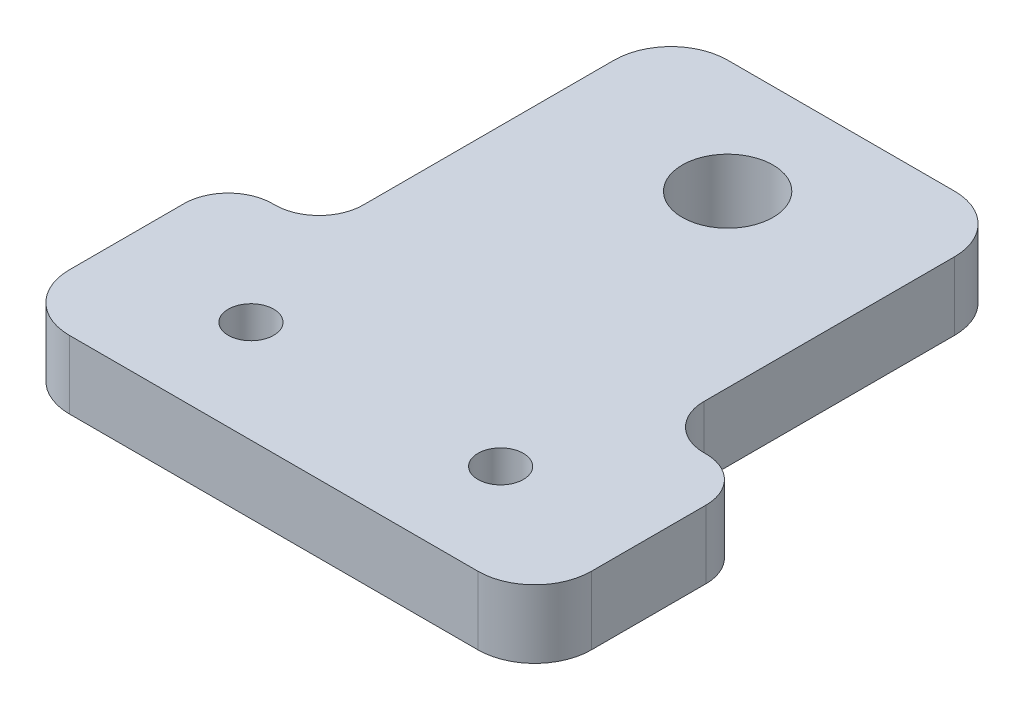
ISO-10303-21;
HEADER;
FILE_DESCRIPTION(('STEP AP214'),'2;1');
FILE_NAME('part.step','',(''),(''),'','','');
FILE_SCHEMA(('AUTOMOTIVE_DESIGN { 1 0 10303 214 1 1 1 1 }'));
ENDSEC;
DATA;
#1=APPLICATION_CONTEXT('core data for automotive mechanical design processes');
#2=APPLICATION_PROTOCOL_DEFINITION('international standard','automotive_design',2000,#1);
#3=PRODUCT_CONTEXT('',#1,'mechanical');
#4=PRODUCT('Part','Part','',(#3));
#5=PRODUCT_RELATED_PRODUCT_CATEGORY('part','',(#4));
#6=PRODUCT_DEFINITION_FORMATION('','',#4);
#7=PRODUCT_DEFINITION_CONTEXT('part definition',#1,'design');
#8=PRODUCT_DEFINITION('design','',#6,#7);
#9=PRODUCT_DEFINITION_SHAPE('','',#8);
#10=(LENGTH_UNIT() NAMED_UNIT(*) SI_UNIT(.MILLI.,.METRE.));
#11=(NAMED_UNIT(*) PLANE_ANGLE_UNIT() SI_UNIT($,.RADIAN.));
#12=(NAMED_UNIT(*) SI_UNIT($,.STERADIAN.) SOLID_ANGLE_UNIT());
#13=UNCERTAINTY_MEASURE_WITH_UNIT(LENGTH_MEASURE(1.E-05),#10,'distance_accuracy_value','');
#14=(GEOMETRIC_REPRESENTATION_CONTEXT(3) GLOBAL_UNCERTAINTY_ASSIGNED_CONTEXT((#13)) GLOBAL_UNIT_ASSIGNED_CONTEXT((#10,
#11,#12)) REPRESENTATION_CONTEXT('',''));
#15=CARTESIAN_POINT('',(0.,0.,0.));
#16=DIRECTION('',(0.,0.,1.));
#17=DIRECTION('',(1.,0.,0.));
#18=AXIS2_PLACEMENT_3D('',#15,#16,#17);
#19=CARTESIAN_POINT('',(0.,6.,0.));
#20=DIRECTION('',(0.,-1.,0.));
#21=DIRECTION('',(0.,0.,-1.));
#22=AXIS2_PLACEMENT_3D('',#19,#20,#21);
#23=PLANE('',#22);
#24=DIRECTION('',(-1.,0.,0.));
#25=VECTOR('',#24,1.);
#26=CARTESIAN_POINT('',(-23.,6.,-19.));
#27=LINE('',#26,#25);
#28=CARTESIAN_POINT('',(-18.9,6.,-19.));
#29=VERTEX_POINT('',#28);
#30=CARTESIAN_POINT('',(-19.1,6.,-19.));
#31=VERTEX_POINT('',#30);
#32=EDGE_CURVE('E278',#29,#31,#27,.T.);
#33=ORIENTED_EDGE('',*,*,#32,.T.);
#34=CARTESIAN_POINT('',(-19.1,6.,-15.1));
#35=DIRECTION('',(0.,-1.,0.));
#36=DIRECTION('',(0.,0.,-1.));
#37=AXIS2_PLACEMENT_3D('',#34,#35,#36);
#38=CIRCLE('',#37,3.9);
#39=CARTESIAN_POINT('',(-23.,6.,-15.1));
#40=VERTEX_POINT('',#39);
#41=EDGE_CURVE('E242',#31,#40,#38,.F.);
#42=ORIENTED_EDGE('',*,*,#41,.T.);
#43=DIRECTION('',(0.,0.,1.));
#44=VECTOR('',#43,1.);
#45=CARTESIAN_POINT('',(-23.,6.,0.));
#46=LINE('',#45,#44);
#47=CARTESIAN_POINT('',(-23.,6.,-5.));
#48=VERTEX_POINT('',#47);
#49=EDGE_CURVE('E276',#40,#48,#46,.T.);
#50=ORIENTED_EDGE('',*,*,#49,.T.);
#51=CARTESIAN_POINT('',(-18.,6.,-5.));
#52=DIRECTION('',(0.,-1.,0.));
#53=DIRECTION('',(0.,0.,-1.));
#54=AXIS2_PLACEMENT_3D('',#51,#52,#53);
#55=CIRCLE('',#54,5.);
#56=CARTESIAN_POINT('',(-18.,6.,0.));
#57=VERTEX_POINT('',#56);
#58=EDGE_CURVE('E208',#48,#57,#55,.F.);
#59=ORIENTED_EDGE('',*,*,#58,.T.);
#60=DIRECTION('',(1.,0.,0.));
#61=VECTOR('',#60,1.);
#62=CARTESIAN_POINT('',(-23.,6.,0.));
#63=LINE('',#62,#61);
#64=CARTESIAN_POINT('',(18.,6.,0.));
#65=VERTEX_POINT('',#64);
#66=EDGE_CURVE('E273',#57,#65,#63,.T.);
#67=ORIENTED_EDGE('',*,*,#66,.T.);
#68=CARTESIAN_POINT('',(18.,6.,-5.));
#69=DIRECTION('',(0.,-1.,0.));
#70=DIRECTION('',(0.,0.,-1.));
#71=AXIS2_PLACEMENT_3D('',#68,#69,#70);
#72=CIRCLE('',#71,5.);
#73=CARTESIAN_POINT('',(23.,6.,-5.));
#74=VERTEX_POINT('',#73);
#75=EDGE_CURVE('E206',#65,#74,#72,.F.);
#76=ORIENTED_EDGE('',*,*,#75,.T.);
#77=DIRECTION('',(0.,0.,-1.));
#78=VECTOR('',#77,1.);
#79=CARTESIAN_POINT('',(23.,6.,0.));
#80=LINE('',#79,#78);
#81=CARTESIAN_POINT('',(23.,6.,-15.1));
#82=VERTEX_POINT('',#81);
#83=EDGE_CURVE('E268',#74,#82,#80,.T.);
#84=ORIENTED_EDGE('',*,*,#83,.T.);
#85=CARTESIAN_POINT('',(19.1,6.,-15.1));
#86=DIRECTION('',(0.,-1.,0.));
#87=DIRECTION('',(0.,0.,-1.));
#88=AXIS2_PLACEMENT_3D('',#85,#86,#87);
#89=CIRCLE('',#88,3.9);
#90=CARTESIAN_POINT('',(19.1,6.,-19.));
#91=VERTEX_POINT('',#90);
#92=EDGE_CURVE('E240',#82,#91,#89,.F.);
#93=ORIENTED_EDGE('',*,*,#92,.T.);
#94=DIRECTION('',(-1.,0.,0.));
#95=VECTOR('',#94,1.);
#96=CARTESIAN_POINT('',(23.,6.,-19.));
#97=LINE('',#96,#95);
#98=CARTESIAN_POINT('',(18.9,6.,-19.));
#99=VERTEX_POINT('',#98);
#100=EDGE_CURVE('E267',#91,#99,#97,.T.);
#101=ORIENTED_EDGE('',*,*,#100,.T.);
#102=CARTESIAN_POINT('',(18.9,6.,-22.9));
#103=DIRECTION('',(0.,-1.,0.));
#104=DIRECTION('',(0.,0.,-1.));
#105=AXIS2_PLACEMENT_3D('',#102,#103,#104);
#106=CIRCLE('',#105,3.9);
#107=CARTESIAN_POINT('',(15.,6.,-22.9));
#108=VERTEX_POINT('',#107);
#109=EDGE_CURVE('E11',#99,#108,#106,.T.);
#110=ORIENTED_EDGE('',*,*,#109,.T.);
#111=DIRECTION('',(0.,0.,-1.));
#112=VECTOR('',#111,1.);
#113=CARTESIAN_POINT('',(15.,6.,-19.));
#114=LINE('',#113,#112);
#115=CARTESIAN_POINT('',(15.,6.,-45.));
#116=VERTEX_POINT('',#115);
#117=EDGE_CURVE('E168',#108,#116,#114,.T.);
#118=ORIENTED_EDGE('',*,*,#117,.T.);
#119=CARTESIAN_POINT('',(10.,6.,-45.));
#120=DIRECTION('',(0.,-1.,0.));
#121=DIRECTION('',(0.,0.,-1.));
#122=AXIS2_PLACEMENT_3D('',#119,#120,#121);
#123=CIRCLE('',#122,5.);
#124=CARTESIAN_POINT('',(9.99999999999999,6.,-50.));
#125=VERTEX_POINT('',#124);
#126=EDGE_CURVE('E210',#116,#125,#123,.F.);
#127=ORIENTED_EDGE('',*,*,#126,.T.);
#128=DIRECTION('',(-1.,0.,0.));
#129=VECTOR('',#128,1.);
#130=CARTESIAN_POINT('',(15.,6.,-50.));
#131=LINE('',#130,#129);
#132=CARTESIAN_POINT('',(-10.,6.,-50.));
#133=VERTEX_POINT('',#132);
#134=EDGE_CURVE('E195',#125,#133,#131,.T.);
#135=ORIENTED_EDGE('',*,*,#134,.T.);
#136=CARTESIAN_POINT('',(-10.,6.,-45.));
#137=DIRECTION('',(0.,-1.,0.));
#138=DIRECTION('',(0.,0.,-1.));
#139=AXIS2_PLACEMENT_3D('',#136,#137,#138);
#140=CIRCLE('',#139,5.);
#141=CARTESIAN_POINT('',(-15.,6.,-45.));
#142=VERTEX_POINT('',#141);
#143=EDGE_CURVE('E212',#133,#142,#140,.F.);
#144=ORIENTED_EDGE('',*,*,#143,.T.);
#145=DIRECTION('',(0.,0.,1.));
#146=VECTOR('',#145,1.);
#147=CARTESIAN_POINT('',(-15.,6.,-19.));
#148=LINE('',#147,#146);
#149=CARTESIAN_POINT('',(-15.,6.,-22.9));
#150=VERTEX_POINT('',#149);
#151=EDGE_CURVE('E166',#142,#150,#148,.T.);
#152=ORIENTED_EDGE('',*,*,#151,.T.);
#153=CARTESIAN_POINT('',(-18.9,6.,-22.9));
#154=DIRECTION('',(0.,-1.,0.));
#155=DIRECTION('',(0.,0.,-1.));
#156=AXIS2_PLACEMENT_3D('',#153,#154,#155);
#157=CIRCLE('',#156,3.9);
#158=EDGE_CURVE('E256',#150,#29,#157,.T.);
#159=ORIENTED_EDGE('',*,*,#158,.T.);
#160=EDGE_LOOP('',(#33,#42,#50,#59,#67,#76,#84,#93,#101,#110,#118,#127,#135,#144,#152,#159));
#161=FACE_BOUND('',#160,.T.);
#162=CARTESIAN_POINT('',(0.,6.,-40.));
#163=DIRECTION('',(0.,1.,0.));
#164=DIRECTION('',(0.,0.,1.));
#165=AXIS2_PLACEMENT_3D('',#162,#163,#164);
#166=CIRCLE('',#165,4.);
#167=CARTESIAN_POINT('',(0.,6.,-36.));
#168=VERTEX_POINT('',#167);
#169=EDGE_CURVE('E181',#168,#168,#166,.T.);
#170=ORIENTED_EDGE('',*,*,#169,.F.);
#171=EDGE_LOOP('',(#170));
#172=FACE_BOUND('',#171,.T.);
#173=CARTESIAN_POINT('',(11.,6.,-9.));
#174=DIRECTION('',(0.,1.,0.));
#175=DIRECTION('',(0.,0.,1.));
#176=AXIS2_PLACEMENT_3D('',#173,#174,#175);
#177=CIRCLE('',#176,2.);
#178=CARTESIAN_POINT('',(11.,6.,-7.));
#179=VERTEX_POINT('',#178);
#180=EDGE_CURVE('E287',#179,#179,#177,.T.);
#181=ORIENTED_EDGE('',*,*,#180,.F.);
#182=EDGE_LOOP('',(#181));
#183=FACE_BOUND('',#182,.T.);
#184=CARTESIAN_POINT('',(-11.,6.,-8.99999999999999));
#185=DIRECTION('',(0.,1.,0.));
#186=DIRECTION('',(0.,0.,-1.));
#187=AXIS2_PLACEMENT_3D('',#184,#185,#186);
#188=CIRCLE('',#187,2.);
#189=CARTESIAN_POINT('',(-11.,6.,-11.));
#190=VERTEX_POINT('',#189);
#191=EDGE_CURVE('E293',#190,#190,#188,.T.);
#192=ORIENTED_EDGE('',*,*,#191,.F.);
#193=EDGE_LOOP('',(#192));
#194=FACE_BOUND('',#193,.T.);
#195=ADVANCED_FACE('F33',(#161,#172,#183,#194),#23,.F.);
#196=CARTESIAN_POINT('',(0.,0.,0.));
#197=DIRECTION('',(0.,-1.,0.));
#198=DIRECTION('',(0.,0.,-1.));
#199=AXIS2_PLACEMENT_3D('',#196,#197,#198);
#200=PLANE('',#199);
#201=CARTESIAN_POINT('',(11.,0.,-9.));
#202=DIRECTION('',(0.,1.,0.));
#203=DIRECTION('',(0.,0.,1.));
#204=AXIS2_PLACEMENT_3D('',#201,#202,#203);
#205=CIRCLE('',#204,2.);
#206=CARTESIAN_POINT('',(11.,0.,-7.));
#207=VERTEX_POINT('',#206);
#208=EDGE_CURVE('E290',#207,#207,#205,.T.);
#209=ORIENTED_EDGE('',*,*,#208,.T.);
#210=EDGE_LOOP('',(#209));
#211=FACE_BOUND('',#210,.T.);
#212=DIRECTION('',(0.,0.,1.));
#213=VECTOR('',#212,1.);
#214=CARTESIAN_POINT('',(-23.,0.,0.));
#215=LINE('',#214,#213);
#216=CARTESIAN_POINT('',(-23.,0.,-15.1));
#217=VERTEX_POINT('',#216);
#218=CARTESIAN_POINT('',(-23.,0.,-5.));
#219=VERTEX_POINT('',#218);
#220=EDGE_CURVE('E179',#217,#219,#215,.T.);
#221=ORIENTED_EDGE('',*,*,#220,.F.);
#222=CARTESIAN_POINT('',(-19.1,0.,-15.1));
#223=DIRECTION('',(0.,-1.,0.));
#224=DIRECTION('',(0.,0.,-1.));
#225=AXIS2_PLACEMENT_3D('',#222,#223,#224);
#226=CIRCLE('',#225,3.9);
#227=CARTESIAN_POINT('',(-19.1,0.,-19.));
#228=VERTEX_POINT('',#227);
#229=EDGE_CURVE('E233',#217,#228,#226,.T.);
#230=ORIENTED_EDGE('',*,*,#229,.T.);
#231=DIRECTION('',(-1.,0.,0.));
#232=VECTOR('',#231,1.);
#233=CARTESIAN_POINT('',(-23.,0.,-19.));
#234=LINE('',#233,#232);
#235=CARTESIAN_POINT('',(-18.9,0.,-19.));
#236=VERTEX_POINT('',#235);
#237=EDGE_CURVE('E175',#236,#228,#234,.T.);
#238=ORIENTED_EDGE('',*,*,#237,.F.);
#239=CARTESIAN_POINT('',(-18.9,0.,-22.9));
#240=DIRECTION('',(0.,-1.,0.));
#241=DIRECTION('',(0.,0.,-1.));
#242=AXIS2_PLACEMENT_3D('',#239,#240,#241);
#243=CIRCLE('',#242,3.9);
#244=CARTESIAN_POINT('',(-15.,0.,-22.9));
#245=VERTEX_POINT('',#244);
#246=EDGE_CURVE('E174',#236,#245,#243,.F.);
#247=ORIENTED_EDGE('',*,*,#246,.T.);
#248=DIRECTION('',(0.,0.,1.));
#249=VECTOR('',#248,1.);
#250=CARTESIAN_POINT('',(-15.,0.,-19.));
#251=LINE('',#250,#249);
#252=CARTESIAN_POINT('',(-15.,0.,-45.));
#253=VERTEX_POINT('',#252);
#254=EDGE_CURVE('E163',#253,#245,#251,.T.);
#255=ORIENTED_EDGE('',*,*,#254,.F.);
#256=CARTESIAN_POINT('',(-10.,0.,-45.));
#257=DIRECTION('',(0.,-1.,0.));
#258=DIRECTION('',(0.,0.,-1.));
#259=AXIS2_PLACEMENT_3D('',#256,#257,#258);
#260=CIRCLE('',#259,5.);
#261=CARTESIAN_POINT('',(-10.,0.,-50.));
#262=VERTEX_POINT('',#261);
#263=EDGE_CURVE('E146',#253,#262,#260,.T.);
#264=ORIENTED_EDGE('',*,*,#263,.T.);
#265=DIRECTION('',(-1.,0.,0.));
#266=VECTOR('',#265,1.);
#267=CARTESIAN_POINT('',(15.,0.,-50.));
#268=LINE('',#267,#266);
#269=CARTESIAN_POINT('',(9.99999999999999,0.,-50.));
#270=VERTEX_POINT('',#269);
#271=EDGE_CURVE('E176',#270,#262,#268,.T.);
#272=ORIENTED_EDGE('',*,*,#271,.F.);
#273=CARTESIAN_POINT('',(10.,0.,-45.));
#274=DIRECTION('',(0.,-1.,0.));
#275=DIRECTION('',(0.,0.,-1.));
#276=AXIS2_PLACEMENT_3D('',#273,#274,#275);
#277=CIRCLE('',#276,5.);
#278=CARTESIAN_POINT('',(15.,0.,-45.));
#279=VERTEX_POINT('',#278);
#280=EDGE_CURVE('E157',#270,#279,#277,.T.);
#281=ORIENTED_EDGE('',*,*,#280,.T.);
#282=DIRECTION('',(0.,0.,-1.));
#283=VECTOR('',#282,1.);
#284=CARTESIAN_POINT('',(15.,0.,-19.));
#285=LINE('',#284,#283);
#286=CARTESIAN_POINT('',(15.,0.,-22.9));
#287=VERTEX_POINT('',#286);
#288=EDGE_CURVE('E194',#287,#279,#285,.T.);
#289=ORIENTED_EDGE('',*,*,#288,.F.);
#290=CARTESIAN_POINT('',(18.9,0.,-22.9));
#291=DIRECTION('',(0.,-1.,0.));
#292=DIRECTION('',(0.,0.,-1.));
#293=AXIS2_PLACEMENT_3D('',#290,#291,#292);
#294=CIRCLE('',#293,3.9);
#295=CARTESIAN_POINT('',(18.9,0.,-19.));
#296=VERTEX_POINT('',#295);
#297=EDGE_CURVE('E41',#287,#296,#294,.F.);
#298=ORIENTED_EDGE('',*,*,#297,.T.);
#299=DIRECTION('',(-1.,0.,0.));
#300=VECTOR('',#299,1.);
#301=CARTESIAN_POINT('',(23.,0.,-19.));
#302=LINE('',#301,#300);
#303=CARTESIAN_POINT('',(19.1,0.,-19.));
#304=VERTEX_POINT('',#303);
#305=EDGE_CURVE('E192',#304,#296,#302,.T.);
#306=ORIENTED_EDGE('',*,*,#305,.F.);
#307=CARTESIAN_POINT('',(19.1,0.,-15.1));
#308=DIRECTION('',(0.,-1.,0.));
#309=DIRECTION('',(0.,0.,-1.));
#310=AXIS2_PLACEMENT_3D('',#307,#308,#309);
#311=CIRCLE('',#310,3.9);
#312=CARTESIAN_POINT('',(23.,0.,-15.1));
#313=VERTEX_POINT('',#312);
#314=EDGE_CURVE('E231',#304,#313,#311,.T.);
#315=ORIENTED_EDGE('',*,*,#314,.T.);
#316=DIRECTION('',(0.,0.,-1.));
#317=VECTOR('',#316,1.);
#318=CARTESIAN_POINT('',(23.,0.,0.));
#319=LINE('',#318,#317);
#320=CARTESIAN_POINT('',(23.,0.,-5.));
#321=VERTEX_POINT('',#320);
#322=EDGE_CURVE('E189',#321,#313,#319,.T.);
#323=ORIENTED_EDGE('',*,*,#322,.F.);
#324=CARTESIAN_POINT('',(18.,0.,-5.));
#325=DIRECTION('',(0.,-1.,0.));
#326=DIRECTION('',(0.,0.,-1.));
#327=AXIS2_PLACEMENT_3D('',#324,#325,#326);
#328=CIRCLE('',#327,5.);
#329=CARTESIAN_POINT('',(18.,0.,0.));
#330=VERTEX_POINT('',#329);
#331=EDGE_CURVE('E167',#321,#330,#328,.T.);
#332=ORIENTED_EDGE('',*,*,#331,.T.);
#333=DIRECTION('',(1.,0.,0.));
#334=VECTOR('',#333,1.);
#335=CARTESIAN_POINT('',(-23.,0.,0.));
#336=LINE('',#335,#334);
#337=CARTESIAN_POINT('',(-18.,0.,0.));
#338=VERTEX_POINT('',#337);
#339=EDGE_CURVE('E186',#338,#330,#336,.T.);
#340=ORIENTED_EDGE('',*,*,#339,.F.);
#341=CARTESIAN_POINT('',(-18.,0.,-5.));
#342=DIRECTION('',(0.,-1.,0.));
#343=DIRECTION('',(0.,0.,-1.));
#344=AXIS2_PLACEMENT_3D('',#341,#342,#343);
#345=CIRCLE('',#344,5.);
#346=EDGE_CURVE('E198',#338,#219,#345,.T.);
#347=ORIENTED_EDGE('',*,*,#346,.T.);
#348=EDGE_LOOP('',(#221,#230,#238,#247,#255,#264,#272,#281,#289,#298,#306,#315,#323,#332,#340,#347));
#349=FACE_BOUND('',#348,.T.);
#350=CARTESIAN_POINT('',(0.,0.,-40.));
#351=DIRECTION('',(0.,1.,0.));
#352=DIRECTION('',(0.,0.,1.));
#353=AXIS2_PLACEMENT_3D('',#350,#351,#352);
#354=CIRCLE('',#353,4.);
#355=CARTESIAN_POINT('',(0.,0.,-36.));
#356=VERTEX_POINT('',#355);
#357=EDGE_CURVE('E284',#356,#356,#354,.T.);
#358=ORIENTED_EDGE('',*,*,#357,.T.);
#359=EDGE_LOOP('',(#358));
#360=FACE_BOUND('',#359,.T.);
#361=CARTESIAN_POINT('',(-11.,0.,-8.99999999999999));
#362=DIRECTION('',(0.,1.,0.));
#363=DIRECTION('',(0.,0.,-1.));
#364=AXIS2_PLACEMENT_3D('',#361,#362,#363);
#365=CIRCLE('',#364,2.);
#366=CARTESIAN_POINT('',(-11.,0.,-11.));
#367=VERTEX_POINT('',#366);
#368=EDGE_CURVE('E296',#367,#367,#365,.T.);
#369=ORIENTED_EDGE('',*,*,#368,.T.);
#370=EDGE_LOOP('',(#369));
#371=FACE_BOUND('',#370,.T.);
#372=ADVANCED_FACE('F171',(#211,#349,#360,#371),#200,.T.);
#373=CARTESIAN_POINT('',(15.,6.,-50.));
#374=DIRECTION('',(0.,0.,1.));
#375=DIRECTION('',(1.,0.,0.));
#376=AXIS2_PLACEMENT_3D('',#373,#374,#375);
#377=PLANE('',#376);
#378=ORIENTED_EDGE('',*,*,#271,.T.);
#379=DIRECTION('',(0.,-1.,0.));
#380=VECTOR('',#379,1.);
#381=CARTESIAN_POINT('',(-10.,6.,-50.));
#382=LINE('',#381,#380);
#383=EDGE_CURVE('E151',#262,#133,#382,.F.);
#384=ORIENTED_EDGE('',*,*,#383,.T.);
#385=ORIENTED_EDGE('',*,*,#134,.F.);
#386=DIRECTION('',(0.,-1.,0.));
#387=VECTOR('',#386,1.);
#388=CARTESIAN_POINT('',(9.99999999999999,6.,-50.));
#389=LINE('',#388,#387);
#390=EDGE_CURVE('E156',#125,#270,#389,.T.);
#391=ORIENTED_EDGE('',*,*,#390,.T.);
#392=EDGE_LOOP('',(#378,#384,#385,#391));
#393=FACE_BOUND('',#392,.T.);
#394=ADVANCED_FACE('F310',(#393),#377,.F.);
#395=CARTESIAN_POINT('',(-15.,6.,-19.));
#396=DIRECTION('',(1.,0.,0.));
#397=DIRECTION('',(0.,0.,-1.));
#398=AXIS2_PLACEMENT_3D('',#395,#396,#397);
#399=PLANE('',#398);
#400=ORIENTED_EDGE('',*,*,#254,.T.);
#401=DIRECTION('',(0.,-1.,0.));
#402=VECTOR('',#401,1.);
#403=CARTESIAN_POINT('',(-15.,6.,-22.9));
#404=LINE('',#403,#402);
#405=EDGE_CURVE('E244',#245,#150,#404,.F.);
#406=ORIENTED_EDGE('',*,*,#405,.T.);
#407=ORIENTED_EDGE('',*,*,#151,.F.);
#408=DIRECTION('',(0.,-1.,0.));
#409=VECTOR('',#408,1.);
#410=CARTESIAN_POINT('',(-15.,6.,-45.));
#411=LINE('',#410,#409);
#412=EDGE_CURVE('E150',#142,#253,#411,.T.);
#413=ORIENTED_EDGE('',*,*,#412,.T.);
#414=EDGE_LOOP('',(#400,#406,#407,#413));
#415=FACE_BOUND('',#414,.T.);
#416=ADVANCED_FACE('F162',(#415),#399,.F.);
#417=CARTESIAN_POINT('',(-23.,6.,-19.));
#418=DIRECTION('',(0.,0.,1.));
#419=DIRECTION('',(1.,0.,0.));
#420=AXIS2_PLACEMENT_3D('',#417,#418,#419);
#421=PLANE('',#420);
#422=ORIENTED_EDGE('',*,*,#237,.T.);
#423=DIRECTION('',(0.,-1.,0.));
#424=VECTOR('',#423,1.);
#425=CARTESIAN_POINT('',(-19.1,6.,-19.));
#426=LINE('',#425,#424);
#427=EDGE_CURVE('E238',#228,#31,#426,.F.);
#428=ORIENTED_EDGE('',*,*,#427,.T.);
#429=ORIENTED_EDGE('',*,*,#32,.F.);
#430=DIRECTION('',(0.,-1.,0.));
#431=VECTOR('',#430,1.);
#432=CARTESIAN_POINT('',(-18.9,0.,-19.));
#433=LINE('',#432,#431);
#434=EDGE_CURVE('E235',#29,#236,#433,.T.);
#435=ORIENTED_EDGE('',*,*,#434,.T.);
#436=EDGE_LOOP('',(#422,#428,#429,#435));
#437=FACE_BOUND('',#436,.T.);
#438=ADVANCED_FACE('F333',(#437),#421,.F.);
#439=CARTESIAN_POINT('',(-23.,6.,0.));
#440=DIRECTION('',(1.,0.,0.));
#441=DIRECTION('',(0.,0.,-1.));
#442=AXIS2_PLACEMENT_3D('',#439,#440,#441);
#443=PLANE('',#442);
#444=ORIENTED_EDGE('',*,*,#49,.F.);
#445=DIRECTION('',(0.,-1.,0.));
#446=VECTOR('',#445,1.);
#447=CARTESIAN_POINT('',(-23.,6.,-15.1));
#448=LINE('',#447,#446);
#449=EDGE_CURVE('E228',#40,#217,#448,.T.);
#450=ORIENTED_EDGE('',*,*,#449,.T.);
#451=ORIENTED_EDGE('',*,*,#220,.T.);
#452=DIRECTION('',(0.,-1.,0.));
#453=VECTOR('',#452,1.);
#454=CARTESIAN_POINT('',(-23.,6.,-5.));
#455=LINE('',#454,#453);
#456=EDGE_CURVE('E222',#219,#48,#455,.F.);
#457=ORIENTED_EDGE('',*,*,#456,.T.);
#458=EDGE_LOOP('',(#444,#450,#451,#457));
#459=FACE_BOUND('',#458,.T.);
#460=ADVANCED_FACE('F329',(#459),#443,.F.);
#461=CARTESIAN_POINT('',(-23.,6.,0.));
#462=DIRECTION('',(0.,0.,-1.));
#463=DIRECTION('',(-1.,0.,0.));
#464=AXIS2_PLACEMENT_3D('',#461,#462,#463);
#465=PLANE('',#464);
#466=ORIENTED_EDGE('',*,*,#66,.F.);
#467=DIRECTION('',(0.,-1.,0.));
#468=VECTOR('',#467,1.);
#469=CARTESIAN_POINT('',(-18.,6.,0.));
#470=LINE('',#469,#468);
#471=EDGE_CURVE('E219',#57,#338,#470,.T.);
#472=ORIENTED_EDGE('',*,*,#471,.T.);
#473=ORIENTED_EDGE('',*,*,#339,.T.);
#474=DIRECTION('',(0.,-1.,0.));
#475=VECTOR('',#474,1.);
#476=CARTESIAN_POINT('',(18.,6.,0.));
#477=LINE('',#476,#475);
#478=EDGE_CURVE('E217',#330,#65,#477,.F.);
#479=ORIENTED_EDGE('',*,*,#478,.T.);
#480=EDGE_LOOP('',(#466,#472,#473,#479));
#481=FACE_BOUND('',#480,.T.);
#482=ADVANCED_FACE('F325',(#481),#465,.F.);
#483=CARTESIAN_POINT('',(23.,6.,0.));
#484=DIRECTION('',(-1.,0.,0.));
#485=DIRECTION('',(0.,0.,1.));
#486=AXIS2_PLACEMENT_3D('',#483,#484,#485);
#487=PLANE('',#486);
#488=ORIENTED_EDGE('',*,*,#322,.T.);
#489=DIRECTION('',(0.,-1.,0.));
#490=VECTOR('',#489,1.);
#491=CARTESIAN_POINT('',(23.,6.,-15.1));
#492=LINE('',#491,#490);
#493=EDGE_CURVE('E250',#313,#82,#492,.F.);
#494=ORIENTED_EDGE('',*,*,#493,.T.);
#495=ORIENTED_EDGE('',*,*,#83,.F.);
#496=DIRECTION('',(0.,-1.,0.));
#497=VECTOR('',#496,1.);
#498=CARTESIAN_POINT('',(23.,6.,-5.));
#499=LINE('',#498,#497);
#500=EDGE_CURVE('E225',#74,#321,#499,.T.);
#501=ORIENTED_EDGE('',*,*,#500,.T.);
#502=EDGE_LOOP('',(#488,#494,#495,#501));
#503=FACE_BOUND('',#502,.T.);
#504=ADVANCED_FACE('F322',(#503),#487,.F.);
#505=CARTESIAN_POINT('',(23.,6.,-19.));
#506=DIRECTION('',(0.,0.,1.));
#507=DIRECTION('',(1.,0.,0.));
#508=AXIS2_PLACEMENT_3D('',#505,#506,#507);
#509=PLANE('',#508);
#510=ORIENTED_EDGE('',*,*,#100,.F.);
#511=DIRECTION('',(0.,-1.,0.));
#512=VECTOR('',#511,1.);
#513=CARTESIAN_POINT('',(19.1,6.,-19.));
#514=LINE('',#513,#512);
#515=EDGE_CURVE('E247',#91,#304,#514,.T.);
#516=ORIENTED_EDGE('',*,*,#515,.T.);
#517=ORIENTED_EDGE('',*,*,#305,.T.);
#518=DIRECTION('',(0.,-1.,0.));
#519=VECTOR('',#518,1.);
#520=CARTESIAN_POINT('',(18.9,6.,-19.));
#521=LINE('',#520,#519);
#522=EDGE_CURVE('E54',#296,#99,#521,.F.);
#523=ORIENTED_EDGE('',*,*,#522,.T.);
#524=EDGE_LOOP('',(#510,#516,#517,#523));
#525=FACE_BOUND('',#524,.T.);
#526=ADVANCED_FACE('F261',(#525),#509,.F.);
#527=CARTESIAN_POINT('',(15.,6.,-19.));
#528=DIRECTION('',(-1.,0.,0.));
#529=DIRECTION('',(0.,0.,1.));
#530=AXIS2_PLACEMENT_3D('',#527,#528,#529);
#531=PLANE('',#530);
#532=ORIENTED_EDGE('',*,*,#117,.F.);
#533=DIRECTION('',(0.,-1.,0.));
#534=VECTOR('',#533,1.);
#535=CARTESIAN_POINT('',(15.,0.,-22.9));
#536=LINE('',#535,#534);
#537=EDGE_CURVE('E252',#108,#287,#536,.T.);
#538=ORIENTED_EDGE('',*,*,#537,.T.);
#539=ORIENTED_EDGE('',*,*,#288,.T.);
#540=DIRECTION('',(0.,-1.,0.));
#541=VECTOR('',#540,1.);
#542=CARTESIAN_POINT('',(15.,6.,-45.));
#543=LINE('',#542,#541);
#544=EDGE_CURVE('E214',#279,#116,#543,.F.);
#545=ORIENTED_EDGE('',*,*,#544,.T.);
#546=EDGE_LOOP('',(#532,#538,#539,#545));
#547=FACE_BOUND('',#546,.T.);
#548=ADVANCED_FACE('F264',(#547),#531,.F.);
#549=CARTESIAN_POINT('',(0.,6.,-40.));
#550=DIRECTION('',(0.,-1.,0.));
#551=DIRECTION('',(0.,0.,-1.));
#552=AXIS2_PLACEMENT_3D('',#549,#550,#551);
#553=CYLINDRICAL_SURFACE('',#552,4.);
#554=ORIENTED_EDGE('',*,*,#169,.T.);
#555=EDGE_LOOP('',(#554));
#556=FACE_BOUND('',#555,.T.);
#557=ORIENTED_EDGE('',*,*,#357,.F.);
#558=EDGE_LOOP('',(#557));
#559=FACE_BOUND('',#558,.T.);
#560=ADVANCED_FACE('F315',(#556,#559),#553,.F.);
#561=CARTESIAN_POINT('',(11.,6.,-9.));
#562=DIRECTION('',(0.,-1.,0.));
#563=DIRECTION('',(0.,0.,-1.));
#564=AXIS2_PLACEMENT_3D('',#561,#562,#563);
#565=CYLINDRICAL_SURFACE('',#564,2.);
#566=ORIENTED_EDGE('',*,*,#180,.T.);
#567=EDGE_LOOP('',(#566));
#568=FACE_BOUND('',#567,.T.);
#569=ORIENTED_EDGE('',*,*,#208,.F.);
#570=EDGE_LOOP('',(#569));
#571=FACE_BOUND('',#570,.T.);
#572=ADVANCED_FACE('F502',(#568,#571),#565,.F.);
#573=CARTESIAN_POINT('',(-11.,6.,-8.99999999999999));
#574=DIRECTION('',(0.,-1.,0.));
#575=DIRECTION('',(0.,0.,-1.));
#576=AXIS2_PLACEMENT_3D('',#573,#574,#575);
#577=CYLINDRICAL_SURFACE('',#576,2.);
#578=ORIENTED_EDGE('',*,*,#191,.T.);
#579=EDGE_LOOP('',(#578));
#580=FACE_BOUND('',#579,.T.);
#581=ORIENTED_EDGE('',*,*,#368,.F.);
#582=EDGE_LOOP('',(#581));
#583=FACE_BOUND('',#582,.T.);
#584=ADVANCED_FACE('F302',(#580,#583),#577,.F.);
#585=CARTESIAN_POINT('',(-10.,6.,-45.));
#586=DIRECTION('',(0.,-1.,0.));
#587=DIRECTION('',(0.,0.,-1.));
#588=AXIS2_PLACEMENT_3D('',#585,#586,#587);
#589=CYLINDRICAL_SURFACE('',#588,5.);
#590=ORIENTED_EDGE('',*,*,#143,.F.);
#591=ORIENTED_EDGE('',*,*,#383,.F.);
#592=ORIENTED_EDGE('',*,*,#263,.F.);
#593=ORIENTED_EDGE('',*,*,#412,.F.);
#594=EDGE_LOOP('',(#590,#591,#592,#593));
#595=FACE_BOUND('',#594,.T.);
#596=ADVANCED_FACE('F149',(#595),#589,.T.);
#597=CARTESIAN_POINT('',(10.,6.,-45.));
#598=DIRECTION('',(0.,-1.,0.));
#599=DIRECTION('',(0.,0.,-1.));
#600=AXIS2_PLACEMENT_3D('',#597,#598,#599);
#601=CYLINDRICAL_SURFACE('',#600,5.);
#602=ORIENTED_EDGE('',*,*,#126,.F.);
#603=ORIENTED_EDGE('',*,*,#544,.F.);
#604=ORIENTED_EDGE('',*,*,#280,.F.);
#605=ORIENTED_EDGE('',*,*,#390,.F.);
#606=EDGE_LOOP('',(#602,#603,#604,#605));
#607=FACE_BOUND('',#606,.T.);
#608=ADVANCED_FACE('F345',(#607),#601,.T.);
#609=CARTESIAN_POINT('',(-18.,6.,-5.));
#610=DIRECTION('',(0.,-1.,0.));
#611=DIRECTION('',(0.,0.,-1.));
#612=AXIS2_PLACEMENT_3D('',#609,#610,#611);
#613=CYLINDRICAL_SURFACE('',#612,5.);
#614=ORIENTED_EDGE('',*,*,#58,.F.);
#615=ORIENTED_EDGE('',*,*,#456,.F.);
#616=ORIENTED_EDGE('',*,*,#346,.F.);
#617=ORIENTED_EDGE('',*,*,#471,.F.);
#618=EDGE_LOOP('',(#614,#615,#616,#617));
#619=FACE_BOUND('',#618,.T.);
#620=ADVANCED_FACE('F348',(#619),#613,.T.);
#621=CARTESIAN_POINT('',(18.,6.,-5.));
#622=DIRECTION('',(0.,-1.,0.));
#623=DIRECTION('',(0.,0.,-1.));
#624=AXIS2_PLACEMENT_3D('',#621,#622,#623);
#625=CYLINDRICAL_SURFACE('',#624,5.);
#626=ORIENTED_EDGE('',*,*,#75,.F.);
#627=ORIENTED_EDGE('',*,*,#478,.F.);
#628=ORIENTED_EDGE('',*,*,#331,.F.);
#629=ORIENTED_EDGE('',*,*,#500,.F.);
#630=EDGE_LOOP('',(#626,#627,#628,#629));
#631=FACE_BOUND('',#630,.T.);
#632=ADVANCED_FACE('F352',(#631),#625,.T.);
#633=CARTESIAN_POINT('',(-19.1,6.,-15.1));
#634=DIRECTION('',(0.,-1.,0.));
#635=DIRECTION('',(0.,0.,-1.));
#636=AXIS2_PLACEMENT_3D('',#633,#634,#635);
#637=CYLINDRICAL_SURFACE('',#636,3.9);
#638=ORIENTED_EDGE('',*,*,#41,.F.);
#639=ORIENTED_EDGE('',*,*,#427,.F.);
#640=ORIENTED_EDGE('',*,*,#229,.F.);
#641=ORIENTED_EDGE('',*,*,#449,.F.);
#642=EDGE_LOOP('',(#638,#639,#640,#641));
#643=FACE_BOUND('',#642,.T.);
#644=ADVANCED_FACE('F356',(#643),#637,.T.);
#645=CARTESIAN_POINT('',(-18.9,6.,-22.9));
#646=DIRECTION('',(0.,1.,0.));
#647=DIRECTION('',(0.,0.,1.));
#648=AXIS2_PLACEMENT_3D('',#645,#646,#647);
#649=CYLINDRICAL_SURFACE('',#648,3.9);
#650=ORIENTED_EDGE('',*,*,#158,.F.);
#651=ORIENTED_EDGE('',*,*,#405,.F.);
#652=ORIENTED_EDGE('',*,*,#246,.F.);
#653=ORIENTED_EDGE('',*,*,#434,.F.);
#654=EDGE_LOOP('',(#650,#651,#652,#653));
#655=FACE_BOUND('',#654,.T.);
#656=ADVANCED_FACE('F360',(#655),#649,.F.);
#657=CARTESIAN_POINT('',(19.1,6.,-15.1));
#658=DIRECTION('',(0.,-1.,0.));
#659=DIRECTION('',(0.,0.,-1.));
#660=AXIS2_PLACEMENT_3D('',#657,#658,#659);
#661=CYLINDRICAL_SURFACE('',#660,3.9);
#662=ORIENTED_EDGE('',*,*,#92,.F.);
#663=ORIENTED_EDGE('',*,*,#493,.F.);
#664=ORIENTED_EDGE('',*,*,#314,.F.);
#665=ORIENTED_EDGE('',*,*,#515,.F.);
#666=EDGE_LOOP('',(#662,#663,#664,#665));
#667=FACE_BOUND('',#666,.T.);
#668=ADVANCED_FACE('F363',(#667),#661,.T.);
#669=CARTESIAN_POINT('',(18.9,6.,-22.9));
#670=DIRECTION('',(0.,1.,0.));
#671=DIRECTION('',(0.,0.,1.));
#672=AXIS2_PLACEMENT_3D('',#669,#670,#671);
#673=CYLINDRICAL_SURFACE('',#672,3.9);
#674=ORIENTED_EDGE('',*,*,#109,.F.);
#675=ORIENTED_EDGE('',*,*,#522,.F.);
#676=ORIENTED_EDGE('',*,*,#297,.F.);
#677=ORIENTED_EDGE('',*,*,#537,.F.);
#678=EDGE_LOOP('',(#674,#675,#676,#677));
#679=FACE_BOUND('',#678,.T.);
#680=ADVANCED_FACE('F35',(#679),#673,.F.);
#681=CLOSED_SHELL('',(#195,#372,#394,#416,#438,#460,#482,#504,#526,#548,#560,#572,#584,#596,
#608,#620,#632,#644,#656,#668,#680));
#682=MANIFOLD_SOLID_BREP('B2',#681);
#683=ADVANCED_BREP_SHAPE_REPRESENTATION('',(#18,#682),#14);
#684=SHAPE_DEFINITION_REPRESENTATION(#9,#683);
ENDSEC;
END-ISO-10303-21;
